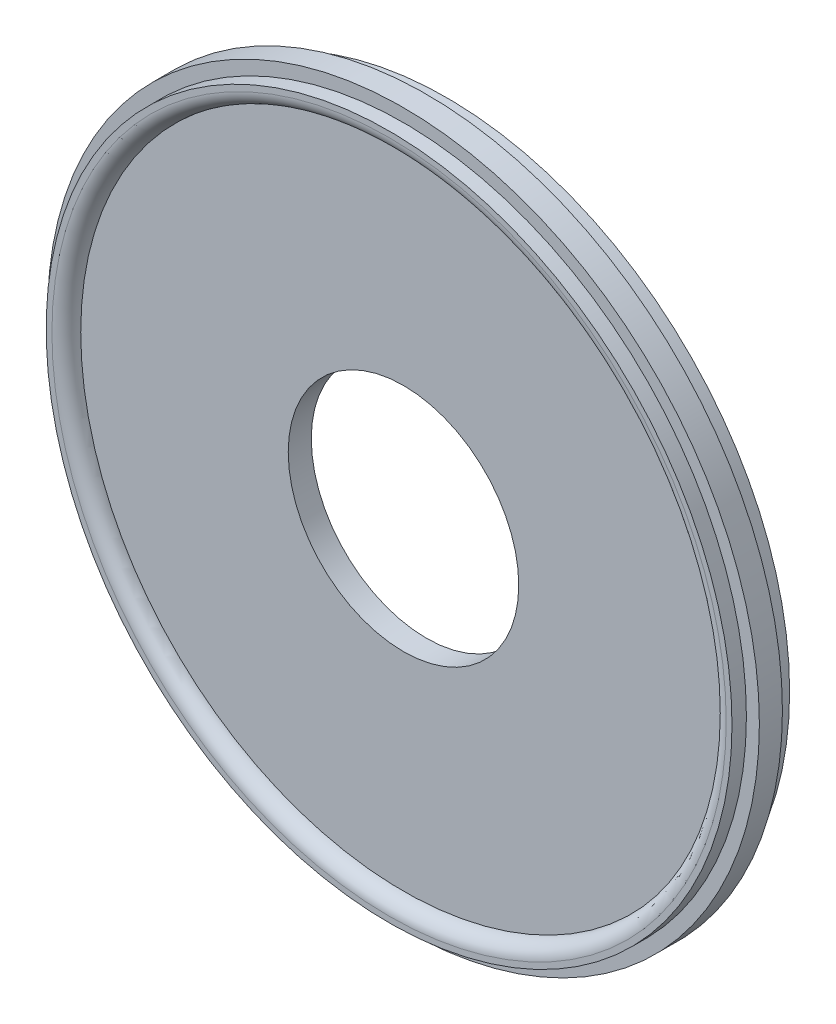
ISO-10303-21;
HEADER;
FILE_DESCRIPTION(('STEP AP214'),'2;1');
FILE_NAME('part.step','',(''),(''),'','','');
FILE_SCHEMA(('AUTOMOTIVE_DESIGN { 1 0 10303 214 1 1 1 1 }'));
ENDSEC;
DATA;
#1=APPLICATION_CONTEXT('core data for automotive mechanical design processes');
#2=APPLICATION_PROTOCOL_DEFINITION('international standard','automotive_design',2000,#1);
#3=PRODUCT_CONTEXT('',#1,'mechanical');
#4=PRODUCT('Part','Part','',(#3));
#5=PRODUCT_RELATED_PRODUCT_CATEGORY('part','',(#4));
#6=PRODUCT_DEFINITION_FORMATION('','',#4);
#7=PRODUCT_DEFINITION_CONTEXT('part definition',#1,'design');
#8=PRODUCT_DEFINITION('design','',#6,#7);
#9=PRODUCT_DEFINITION_SHAPE('','',#8);
#10=(LENGTH_UNIT() NAMED_UNIT(*) SI_UNIT(.MILLI.,.METRE.));
#11=(NAMED_UNIT(*) PLANE_ANGLE_UNIT() SI_UNIT($,.RADIAN.));
#12=(NAMED_UNIT(*) SI_UNIT($,.STERADIAN.) SOLID_ANGLE_UNIT());
#13=UNCERTAINTY_MEASURE_WITH_UNIT(LENGTH_MEASURE(1.E-05),#10,'distance_accuracy_value','');
#14=(GEOMETRIC_REPRESENTATION_CONTEXT(3) GLOBAL_UNCERTAINTY_ASSIGNED_CONTEXT((#13)) GLOBAL_UNIT_ASSIGNED_CONTEXT((#10,
#11,#12)) REPRESENTATION_CONTEXT('',''));
#15=CARTESIAN_POINT('',(0.,0.,0.));
#16=DIRECTION('',(0.,0.,1.));
#17=DIRECTION('',(1.,0.,0.));
#18=AXIS2_PLACEMENT_3D('',#15,#16,#17);
#19=CARTESIAN_POINT('',(0.,0.,7.5));
#20=DIRECTION('',(0.,0.,1.));
#21=DIRECTION('',(1.,0.,0.));
#22=AXIS2_PLACEMENT_3D('',#19,#20,#21);
#23=PLANE('',#22);
#24=CARTESIAN_POINT('',(0.,0.,7.5));
#25=DIRECTION('',(0.,0.,1.));
#26=DIRECTION('',(1.,0.,0.));
#27=AXIS2_PLACEMENT_3D('',#24,#25,#26);
#28=CIRCLE('',#27,61.75);
#29=CARTESIAN_POINT('',(61.75,0.,7.5));
#30=VERTEX_POINT('',#29);
#31=EDGE_CURVE('E58',#30,#30,#28,.T.);
#32=ORIENTED_EDGE('',*,*,#31,.T.);
#33=EDGE_LOOP('',(#32));
#34=FACE_BOUND('',#33,.T.);
#35=CARTESIAN_POINT('',(0.,0.,7.5));
#36=DIRECTION('',(0.,0.,1.));
#37=DIRECTION('',(1.,0.,0.));
#38=AXIS2_PLACEMENT_3D('',#35,#36,#37);
#39=CIRCLE('',#38,59.5);
#40=CARTESIAN_POINT('',(59.5,0.,7.5));
#41=VERTEX_POINT('',#40);
#42=EDGE_CURVE('E65',#41,#41,#39,.T.);
#43=ORIENTED_EDGE('',*,*,#42,.F.);
#44=EDGE_LOOP('',(#43));
#45=FACE_BOUND('',#44,.T.);
#46=ADVANCED_FACE('F32',(#34,#45),#23,.T.);
#47=CARTESIAN_POINT('',(0.,0.,0.));
#48=DIRECTION('',(0.,0.,1.));
#49=DIRECTION('',(1.,0.,0.));
#50=AXIS2_PLACEMENT_3D('',#47,#48,#49);
#51=PLANE('',#50);
#52=CARTESIAN_POINT('',(0.,0.,0.));
#53=DIRECTION('',(0.,0.,1.));
#54=DIRECTION('',(1.,0.,0.));
#55=AXIS2_PLACEMENT_3D('',#52,#53,#54);
#56=CIRCLE('',#55,59.5);
#57=CARTESIAN_POINT('',(59.5,0.,0.));
#58=VERTEX_POINT('',#57);
#59=EDGE_CURVE('E47',#58,#58,#56,.T.);
#60=ORIENTED_EDGE('',*,*,#59,.F.);
#61=EDGE_LOOP('',(#60));
#62=FACE_BOUND('',#61,.T.);
#63=CARTESIAN_POINT('',(0.,0.,0.));
#64=DIRECTION('',(0.,0.,1.));
#65=DIRECTION('',(1.,0.,0.));
#66=AXIS2_PLACEMENT_3D('',#63,#64,#65);
#67=CIRCLE('',#66,52.);
#68=CARTESIAN_POINT('',(52.,0.,0.));
#69=VERTEX_POINT('',#68);
#70=EDGE_CURVE('E51',#69,#69,#67,.T.);
#71=ORIENTED_EDGE('',*,*,#70,.T.);
#72=EDGE_LOOP('',(#71));
#73=FACE_BOUND('',#72,.T.);
#74=ADVANCED_FACE('F95',(#62,#73),#51,.F.);
#75=CARTESIAN_POINT('',(0.,0.,3.5));
#76=DIRECTION('',(0.,0.,-1.));
#77=DIRECTION('',(-1.,0.,0.));
#78=AXIS2_PLACEMENT_3D('',#75,#76,#77);
#79=CYLINDRICAL_SURFACE('',#78,59.5);
#80=CARTESIAN_POINT('',(0.,0.,3.5));
#81=DIRECTION('',(0.,0.,1.));
#82=DIRECTION('',(1.,0.,0.));
#83=AXIS2_PLACEMENT_3D('',#80,#81,#82);
#84=CIRCLE('',#83,59.5);
#85=CARTESIAN_POINT('',(59.5,0.,3.5));
#86=VERTEX_POINT('',#85);
#87=EDGE_CURVE('E43',#86,#86,#84,.T.);
#88=ORIENTED_EDGE('',*,*,#87,.F.);
#89=EDGE_LOOP('',(#88));
#90=FACE_BOUND('',#89,.T.);
#91=ORIENTED_EDGE('',*,*,#59,.T.);
#92=EDGE_LOOP('',(#91));
#93=FACE_BOUND('',#92,.T.);
#94=ADVANCED_FACE('F100',(#90,#93),#79,.T.);
#95=CARTESIAN_POINT('',(0.,0.,3.5));
#96=DIRECTION('',(0.,0.,-1.));
#97=DIRECTION('',(-1.,0.,0.));
#98=AXIS2_PLACEMENT_3D('',#95,#96,#97);
#99=CYLINDRICAL_SURFACE('',#98,52.);
#100=CARTESIAN_POINT('',(0.,0.,3.5));
#101=DIRECTION('',(0.,0.,1.));
#102=DIRECTION('',(1.,0.,0.));
#103=AXIS2_PLACEMENT_3D('',#100,#101,#102);
#104=CIRCLE('',#103,52.);
#105=CARTESIAN_POINT('',(52.,0.,3.5));
#106=VERTEX_POINT('',#105);
#107=EDGE_CURVE('E55',#106,#106,#104,.T.);
#108=ORIENTED_EDGE('',*,*,#107,.T.);
#109=EDGE_LOOP('',(#108));
#110=FACE_BOUND('',#109,.T.);
#111=ORIENTED_EDGE('',*,*,#70,.F.);
#112=EDGE_LOOP('',(#111));
#113=FACE_BOUND('',#112,.T.);
#114=ADVANCED_FACE('F122',(#110,#113),#99,.F.);
#115=CARTESIAN_POINT('',(0.,0.,3.5));
#116=DIRECTION('',(0.,0.,1.));
#117=DIRECTION('',(1.,0.,0.));
#118=AXIS2_PLACEMENT_3D('',#115,#116,#117);
#119=PLANE('',#118);
#120=CARTESIAN_POINT('',(0.,0.,3.5));
#121=DIRECTION('',(0.,0.,1.));
#122=DIRECTION('',(1.,0.,0.));
#123=AXIS2_PLACEMENT_3D('',#120,#121,#122);
#124=CIRCLE('',#123,20.);
#125=CARTESIAN_POINT('',(20.,0.,3.5));
#126=VERTEX_POINT('',#125);
#127=EDGE_CURVE('E68',#126,#126,#124,.T.);
#128=ORIENTED_EDGE('',*,*,#127,.T.);
#129=EDGE_LOOP('',(#128));
#130=FACE_BOUND('',#129,.T.);
#131=ORIENTED_EDGE('',*,*,#107,.F.);
#132=EDGE_LOOP('',(#131));
#133=FACE_BOUND('',#132,.T.);
#134=ADVANCED_FACE('F117',(#130,#133),#119,.F.);
#135=CARTESIAN_POINT('',(0.,0.,3.5));
#136=DIRECTION('',(0.,0.,1.));
#137=DIRECTION('',(1.,0.,0.));
#138=AXIS2_PLACEMENT_3D('',#135,#136,#137);
#139=CIRCLE('',#138,61.75);
#140=CARTESIAN_POINT('',(61.75,0.,3.5));
#141=VERTEX_POINT('',#140);
#142=EDGE_CURVE('E59',#141,#141,#139,.T.);
#143=ORIENTED_EDGE('',*,*,#142,.F.);
#144=EDGE_LOOP('',(#143));
#145=FACE_BOUND('',#144,.T.);
#146=ORIENTED_EDGE('',*,*,#87,.T.);
#147=EDGE_LOOP('',(#146));
#148=FACE_BOUND('',#147,.T.);
#149=ADVANCED_FACE('F111',(#145,#148),#119,.F.);
#150=CARTESIAN_POINT('',(0.,0.,7.5));
#151=DIRECTION('',(0.,0.,-1.));
#152=DIRECTION('',(-1.,0.,0.));
#153=AXIS2_PLACEMENT_3D('',#150,#151,#152);
#154=CYLINDRICAL_SURFACE('',#153,61.75);
#155=ORIENTED_EDGE('',*,*,#31,.F.);
#156=EDGE_LOOP('',(#155));
#157=FACE_BOUND('',#156,.T.);
#158=ORIENTED_EDGE('',*,*,#142,.T.);
#159=EDGE_LOOP('',(#158));
#160=FACE_BOUND('',#159,.T.);
#161=ADVANCED_FACE('F108',(#157,#160),#154,.T.);
#162=CARTESIAN_POINT('',(0.,0.,10.));
#163=DIRECTION('',(0.,0.,1.));
#164=DIRECTION('',(1.,0.,0.));
#165=AXIS2_PLACEMENT_3D('',#162,#163,#164);
#166=PLANE('',#165);
#167=CARTESIAN_POINT('',(0.,0.,10.));
#168=DIRECTION('',(0.,0.,1.));
#169=DIRECTION('',(1.,0.,0.));
#170=AXIS2_PLACEMENT_3D('',#167,#168,#169);
#171=CIRCLE('',#170,58.5);
#172=CARTESIAN_POINT('',(58.5,0.,10.));
#173=VERTEX_POINT('',#172);
#174=EDGE_CURVE('E10',#173,#173,#171,.F.);
#175=ORIENTED_EDGE('',*,*,#174,.T.);
#176=EDGE_LOOP('',(#175));
#177=FACE_BOUND('',#176,.T.);
#178=CARTESIAN_POINT('',(0.,0.,10.));
#179=DIRECTION('',(0.,0.,1.));
#180=DIRECTION('',(1.,0.,0.));
#181=AXIS2_PLACEMENT_3D('',#178,#179,#180);
#182=CIRCLE('',#181,59.5);
#183=CARTESIAN_POINT('',(59.5,0.,10.));
#184=VERTEX_POINT('',#183);
#185=EDGE_CURVE('E62',#184,#184,#182,.T.);
#186=ORIENTED_EDGE('',*,*,#185,.T.);
#187=EDGE_LOOP('',(#186));
#188=FACE_BOUND('',#187,.T.);
#189=ADVANCED_FACE('F90',(#177,#188),#166,.T.);
#190=CARTESIAN_POINT('',(0.,0.,10.));
#191=DIRECTION('',(0.,0.,-1.));
#192=DIRECTION('',(-1.,0.,0.));
#193=AXIS2_PLACEMENT_3D('',#190,#191,#192);
#194=CYLINDRICAL_SURFACE('',#193,59.5);
#195=ORIENTED_EDGE('',*,*,#185,.F.);
#196=EDGE_LOOP('',(#195));
#197=FACE_BOUND('',#196,.T.);
#198=ORIENTED_EDGE('',*,*,#42,.T.);
#199=EDGE_LOOP('',(#198));
#200=FACE_BOUND('',#199,.T.);
#201=ADVANCED_FACE('F83',(#197,#200),#194,.T.);
#202=CARTESIAN_POINT('',(0.,0.,7.5));
#203=DIRECTION('',(0.,0.,1.));
#204=DIRECTION('',(1.,0.,0.));
#205=AXIS2_PLACEMENT_3D('',#202,#203,#204);
#206=CIRCLE('',#205,20.);
#207=CARTESIAN_POINT('',(20.,0.,7.5));
#208=VERTEX_POINT('',#207);
#209=EDGE_CURVE('E73',#208,#208,#206,.T.);
#210=ORIENTED_EDGE('',*,*,#209,.F.);
#211=EDGE_LOOP('',(#210));
#212=FACE_BOUND('',#211,.T.);
#213=CARTESIAN_POINT('',(0.,0.,7.5));
#214=DIRECTION('',(0.,0.,1.));
#215=DIRECTION('',(1.,0.,0.));
#216=AXIS2_PLACEMENT_3D('',#213,#214,#215);
#217=CIRCLE('',#216,56.);
#218=CARTESIAN_POINT('',(56.,0.,7.5));
#219=VERTEX_POINT('',#218);
#220=EDGE_CURVE('E39',#219,#219,#217,.F.);
#221=ORIENTED_EDGE('',*,*,#220,.F.);
#222=EDGE_LOOP('',(#221));
#223=FACE_BOUND('',#222,.T.);
#224=ADVANCED_FACE('F80',(#212,#223),#23,.T.);
#225=CARTESIAN_POINT('',(0.,0.,7.5));
#226=DIRECTION('',(0.,0.,1.));
#227=DIRECTION('',(1.,0.,0.));
#228=AXIS2_PLACEMENT_3D('',#225,#226,#227);
#229=TOROIDAL_SURFACE('',#228,58.5,2.5);
#230=ORIENTED_EDGE('',*,*,#174,.F.);
#231=EDGE_LOOP('',(#230));
#232=FACE_BOUND('',#231,.T.);
#233=ORIENTED_EDGE('',*,*,#220,.T.);
#234=EDGE_LOOP('',(#233));
#235=FACE_BOUND('',#234,.T.);
#236=ADVANCED_FACE('F34',(#232,#235),#229,.T.);
#237=CARTESIAN_POINT('',(0.,0.,-15.));
#238=DIRECTION('',(0.,0.,1.));
#239=DIRECTION('',(1.,0.,0.));
#240=AXIS2_PLACEMENT_3D('',#237,#238,#239);
#241=CYLINDRICAL_SURFACE('',#240,20.);
#242=CARTESIAN_POINT('',(20.,0.,7.5));
#243=CARTESIAN_POINT('',(20.,0.,7.45833333333333));
#244=CARTESIAN_POINT('',(20.,0.,7.41666666666666));
#245=CARTESIAN_POINT('',(20.,0.,7.33333333333333));
#246=CARTESIAN_POINT('',(20.,0.,7.29166666666666));
#247=CARTESIAN_POINT('',(20.,0.,7.20833333333333));
#248=CARTESIAN_POINT('',(20.,0.,7.16666666666666));
#249=CARTESIAN_POINT('',(20.,0.,7.08333333333333));
#250=CARTESIAN_POINT('',(20.,0.,7.04166666666666));
#251=CARTESIAN_POINT('',(20.,0.,6.95833333333333));
#252=CARTESIAN_POINT('',(20.,0.,6.91666666666666));
#253=CARTESIAN_POINT('',(20.,0.,6.83333333333333));
#254=CARTESIAN_POINT('',(20.,0.,6.79166666666666));
#255=CARTESIAN_POINT('',(20.,0.,6.70833333333333));
#256=CARTESIAN_POINT('',(20.,0.,6.66666666666666));
#257=CARTESIAN_POINT('',(20.,0.,6.58333333333333));
#258=CARTESIAN_POINT('',(20.,0.,6.54166666666666));
#259=CARTESIAN_POINT('',(20.,0.,6.45833333333333));
#260=CARTESIAN_POINT('',(20.,0.,6.41666666666666));
#261=CARTESIAN_POINT('',(20.,0.,6.33333333333333));
#262=CARTESIAN_POINT('',(20.,0.,6.29166666666667));
#263=CARTESIAN_POINT('',(20.,0.,6.20833333333333));
#264=CARTESIAN_POINT('',(20.,0.,6.16666666666667));
#265=CARTESIAN_POINT('',(20.,0.,6.08333333333333));
#266=CARTESIAN_POINT('',(20.,0.,6.04166666666667));
#267=CARTESIAN_POINT('',(20.,0.,5.95833333333333));
#268=CARTESIAN_POINT('',(20.,0.,5.91666666666666));
#269=CARTESIAN_POINT('',(20.,0.,5.83333333333333));
#270=CARTESIAN_POINT('',(20.,0.,5.79166666666666));
#271=CARTESIAN_POINT('',(20.,0.,5.70833333333333));
#272=CARTESIAN_POINT('',(20.,0.,5.66666666666666));
#273=CARTESIAN_POINT('',(20.,0.,5.58333333333333));
#274=CARTESIAN_POINT('',(20.,0.,5.54166666666666));
#275=CARTESIAN_POINT('',(20.,0.,5.45833333333333));
#276=CARTESIAN_POINT('',(20.,0.,5.41666666666666));
#277=CARTESIAN_POINT('',(20.,0.,5.33333333333333));
#278=CARTESIAN_POINT('',(20.,0.,5.29166666666666));
#279=CARTESIAN_POINT('',(20.,0.,5.20833333333333));
#280=CARTESIAN_POINT('',(20.,0.,5.16666666666666));
#281=CARTESIAN_POINT('',(20.,0.,5.08333333333333));
#282=CARTESIAN_POINT('',(20.,0.,5.04166666666666));
#283=CARTESIAN_POINT('',(20.,0.,4.95833333333333));
#284=CARTESIAN_POINT('',(20.,0.,4.91666666666666));
#285=CARTESIAN_POINT('',(20.,0.,4.83333333333333));
#286=CARTESIAN_POINT('',(20.,0.,4.79166666666666));
#287=CARTESIAN_POINT('',(20.,0.,4.70833333333333));
#288=CARTESIAN_POINT('',(20.,0.,4.66666666666667));
#289=CARTESIAN_POINT('',(20.,0.,4.58333333333333));
#290=CARTESIAN_POINT('',(20.,0.,4.54166666666667));
#291=CARTESIAN_POINT('',(20.,0.,4.45833333333333));
#292=CARTESIAN_POINT('',(20.,0.,4.41666666666667));
#293=CARTESIAN_POINT('',(20.,0.,4.33333333333333));
#294=CARTESIAN_POINT('',(20.,0.,4.29166666666667));
#295=CARTESIAN_POINT('',(20.,0.,4.20833333333333));
#296=CARTESIAN_POINT('',(20.,0.,4.16666666666667));
#297=CARTESIAN_POINT('',(20.,0.,4.08333333333333));
#298=CARTESIAN_POINT('',(20.,0.,4.04166666666667));
#299=CARTESIAN_POINT('',(20.,0.,3.95833333333333));
#300=CARTESIAN_POINT('',(20.,0.,3.91666666666667));
#301=CARTESIAN_POINT('',(20.,0.,3.83333333333333));
#302=CARTESIAN_POINT('',(20.,0.,3.79166666666667));
#303=CARTESIAN_POINT('',(20.,0.,3.70833333333333));
#304=CARTESIAN_POINT('',(20.,0.,3.66666666666667));
#305=CARTESIAN_POINT('',(20.,0.,3.58333333333333));
#306=CARTESIAN_POINT('',(20.,0.,3.54166666666667));
#307=CARTESIAN_POINT('',(20.,0.,3.5));
#308=B_SPLINE_CURVE_WITH_KNOTS('',3,(#242,#243,#244,#245,#246,#247,#248,#249,#250,#251,#252,
#253,#254,#255,#256,#257,#258,#259,#260,#261,#262,#263,#264,#265,#266,#267,#268,#269,#270,#271,
#272,#273,#274,#275,#276,#277,#278,#279,#280,#281,#282,#283,#284,#285,#286,#287,#288,#289,#290,
#291,#292,#293,#294,#295,#296,#297,#298,#299,#300,#301,#302,#303,#304,#305,#306,#307),
.UNSPECIFIED.,.F.,.F.,(4,2,2,2,2,2,2,2,2,2,2,2,2,2,2,2,2,2,2,2,2,2,2,2,2,2,2,2,2,2,2,2,4),(0.,
0.125,0.25,0.375,0.5,0.625000000000001,0.750000000000001,0.875000000000001,1.,1.125,1.25,1.375,
1.5,1.625,1.75,1.875,2.,2.125,2.25,2.375,2.5,2.625,2.75,2.875,3.,3.125,3.25,3.375,3.5,3.625,
3.75,3.875,4.),.UNSPECIFIED.);
#309=EDGE_CURVE('BSEAM77',#208,#126,#308,.T.);
#310=ORIENTED_EDGE('',*,*,#209,.T.);
#311=ORIENTED_EDGE('',*,*,#127,.F.);
#312=ORIENTED_EDGE('',*,*,#309,.T.);
#313=ORIENTED_EDGE('',*,*,#309,.F.);
#314=EDGE_LOOP('',(#310,#312,#311,#313));
#315=FACE_BOUND('',#314,.T.);
#316=ADVANCED_FACE('F77',(#315),#241,.F.);
#317=CLOSED_SHELL('',(#46,#74,#94,#114,#134,#149,#161,#189,#201,#224,#236,#316));
#318=MANIFOLD_SOLID_BREP('B2',#317);
#319=ADVANCED_BREP_SHAPE_REPRESENTATION('',(#18,#318),#14);
#320=SHAPE_DEFINITION_REPRESENTATION(#9,#319);
ENDSEC;
END-ISO-10303-21;
